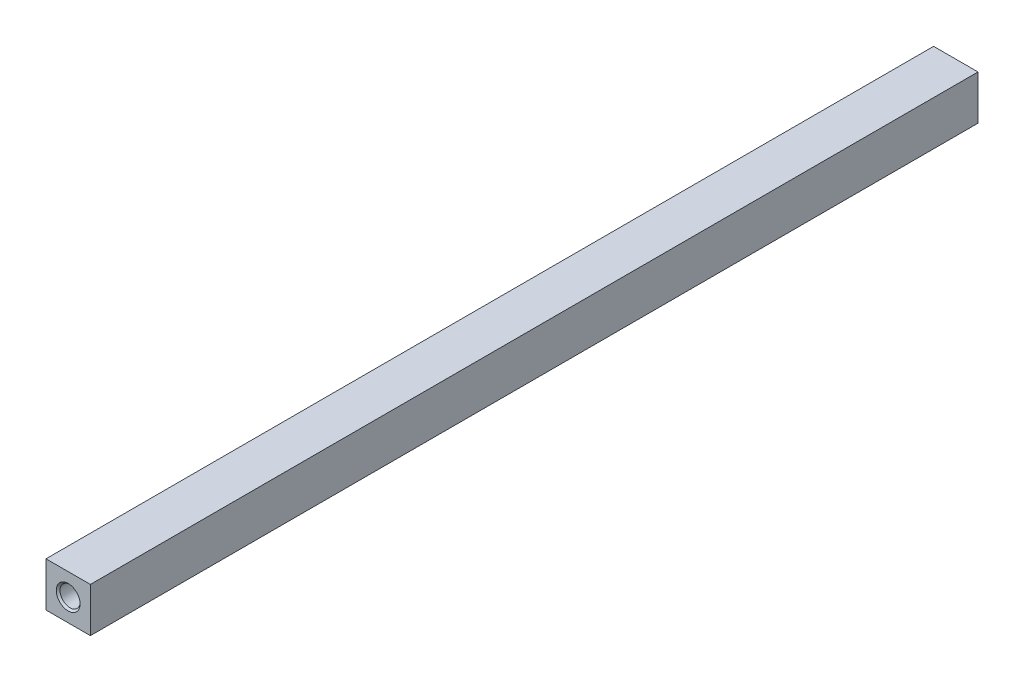
ISO-10303-21;
HEADER;
FILE_DESCRIPTION(('STEP AP214'),'2;1');
FILE_NAME('part.step','',(''),(''),'','','');
FILE_SCHEMA(('AUTOMOTIVE_DESIGN { 1 0 10303 214 1 1 1 1 }'));
ENDSEC;
DATA;
#1=APPLICATION_CONTEXT('core data for automotive mechanical design processes');
#2=APPLICATION_PROTOCOL_DEFINITION('international standard','automotive_design',2000,#1);
#3=PRODUCT_CONTEXT('',#1,'mechanical');
#4=PRODUCT('Part','Part','',(#3));
#5=PRODUCT_RELATED_PRODUCT_CATEGORY('part','',(#4));
#6=PRODUCT_DEFINITION_FORMATION('','',#4);
#7=PRODUCT_DEFINITION_CONTEXT('part definition',#1,'design');
#8=PRODUCT_DEFINITION('design','',#6,#7);
#9=PRODUCT_DEFINITION_SHAPE('','',#8);
#10=(LENGTH_UNIT() NAMED_UNIT(*) SI_UNIT(.MILLI.,.METRE.));
#11=(NAMED_UNIT(*) PLANE_ANGLE_UNIT() SI_UNIT($,.RADIAN.));
#12=(NAMED_UNIT(*) SI_UNIT($,.STERADIAN.) SOLID_ANGLE_UNIT());
#13=UNCERTAINTY_MEASURE_WITH_UNIT(LENGTH_MEASURE(1.E-05),#10,'distance_accuracy_value','');
#14=(GEOMETRIC_REPRESENTATION_CONTEXT(3) GLOBAL_UNCERTAINTY_ASSIGNED_CONTEXT((#13)) GLOBAL_UNIT_ASSIGNED_CONTEXT((#10,
#11,#12)) REPRESENTATION_CONTEXT('',''));
#15=CARTESIAN_POINT('',(0.,0.,0.));
#16=DIRECTION('',(0.,0.,1.));
#17=DIRECTION('',(1.,0.,0.));
#18=AXIS2_PLACEMENT_3D('',#15,#16,#17);
#19=CARTESIAN_POINT('',(7.5,-7.5,150.));
#20=DIRECTION('',(-1.,0.,0.));
#21=DIRECTION('',(0.,0.,1.));
#22=AXIS2_PLACEMENT_3D('',#19,#20,#21);
#23=PLANE('',#22);
#24=DIRECTION('',(0.,1.,0.));
#25=VECTOR('',#24,1.);
#26=CARTESIAN_POINT('',(7.5,-7.5,-150.));
#27=LINE('',#26,#25);
#28=CARTESIAN_POINT('',(7.5,-7.5,-150.));
#29=VERTEX_POINT('',#28);
#30=CARTESIAN_POINT('',(7.5,7.5,-150.));
#31=VERTEX_POINT('',#30);
#32=EDGE_CURVE('E124',#29,#31,#27,.T.);
#33=ORIENTED_EDGE('',*,*,#32,.T.);
#34=DIRECTION('',(0.,0.,-1.));
#35=VECTOR('',#34,1.);
#36=CARTESIAN_POINT('',(7.5,7.5,150.));
#37=LINE('',#36,#35);
#38=CARTESIAN_POINT('',(7.5,7.5,150.));
#39=VERTEX_POINT('',#38);
#40=EDGE_CURVE('E11',#39,#31,#37,.T.);
#41=ORIENTED_EDGE('',*,*,#40,.F.);
#42=DIRECTION('',(0.,1.,0.));
#43=VECTOR('',#42,1.);
#44=CARTESIAN_POINT('',(7.5,-7.5,150.));
#45=LINE('',#44,#43);
#46=CARTESIAN_POINT('',(7.5,-7.5,150.));
#47=VERTEX_POINT('',#46);
#48=EDGE_CURVE('E125',#47,#39,#45,.T.);
#49=ORIENTED_EDGE('',*,*,#48,.F.);
#50=DIRECTION('',(0.,0.,-1.));
#51=VECTOR('',#50,1.);
#52=CARTESIAN_POINT('',(7.5,-7.5,150.));
#53=LINE('',#52,#51);
#54=EDGE_CURVE('E131',#47,#29,#53,.T.);
#55=ORIENTED_EDGE('',*,*,#54,.T.);
#56=EDGE_LOOP('',(#33,#41,#49,#55));
#57=FACE_BOUND('',#56,.T.);
#58=ADVANCED_FACE('F44',(#57),#23,.F.);
#59=CARTESIAN_POINT('',(-7.5,7.5,150.));
#60=DIRECTION('',(0.,-1.,0.));
#61=DIRECTION('',(0.,0.,-1.));
#62=AXIS2_PLACEMENT_3D('',#59,#60,#61);
#63=PLANE('',#62);
#64=DIRECTION('',(-1.,0.,0.));
#65=VECTOR('',#64,1.);
#66=CARTESIAN_POINT('',(-7.5,7.5,-150.));
#67=LINE('',#66,#65);
#68=CARTESIAN_POINT('',(-7.5,7.5,-150.));
#69=VERTEX_POINT('',#68);
#70=EDGE_CURVE('E134',#31,#69,#67,.T.);
#71=ORIENTED_EDGE('',*,*,#70,.T.);
#72=DIRECTION('',(0.,0.,-1.));
#73=VECTOR('',#72,1.);
#74=CARTESIAN_POINT('',(-7.5,7.5,150.));
#75=LINE('',#74,#73);
#76=CARTESIAN_POINT('',(-7.5,7.5,150.));
#77=VERTEX_POINT('',#76);
#78=EDGE_CURVE('E52',#77,#69,#75,.T.);
#79=ORIENTED_EDGE('',*,*,#78,.F.);
#80=DIRECTION('',(-1.,0.,0.));
#81=VECTOR('',#80,1.);
#82=CARTESIAN_POINT('',(-7.5,7.5,150.));
#83=LINE('',#82,#81);
#84=EDGE_CURVE('E91',#39,#77,#83,.T.);
#85=ORIENTED_EDGE('',*,*,#84,.F.);
#86=ORIENTED_EDGE('',*,*,#40,.T.);
#87=EDGE_LOOP('',(#71,#79,#85,#86));
#88=FACE_BOUND('',#87,.T.);
#89=ADVANCED_FACE('F158',(#88),#63,.F.);
#90=CARTESIAN_POINT('',(-7.5,-7.5,150.));
#91=DIRECTION('',(1.,0.,0.));
#92=DIRECTION('',(0.,0.,-1.));
#93=AXIS2_PLACEMENT_3D('',#90,#91,#92);
#94=PLANE('',#93);
#95=DIRECTION('',(0.,-1.,0.));
#96=VECTOR('',#95,1.);
#97=CARTESIAN_POINT('',(-7.5,-7.5,-150.));
#98=LINE('',#97,#96);
#99=CARTESIAN_POINT('',(-7.5,-7.5,-150.));
#100=VERTEX_POINT('',#99);
#101=EDGE_CURVE('E78',#69,#100,#98,.T.);
#102=ORIENTED_EDGE('',*,*,#101,.T.);
#103=DIRECTION('',(0.,0.,-1.));
#104=VECTOR('',#103,1.);
#105=CARTESIAN_POINT('',(-7.5,-7.5,150.));
#106=LINE('',#105,#104);
#107=CARTESIAN_POINT('',(-7.5,-7.5,150.));
#108=VERTEX_POINT('',#107);
#109=EDGE_CURVE('E139',#108,#100,#106,.T.);
#110=ORIENTED_EDGE('',*,*,#109,.F.);
#111=DIRECTION('',(0.,-1.,0.));
#112=VECTOR('',#111,1.);
#113=CARTESIAN_POINT('',(-7.5,-7.5,150.));
#114=LINE('',#113,#112);
#115=EDGE_CURVE('E128',#77,#108,#114,.T.);
#116=ORIENTED_EDGE('',*,*,#115,.F.);
#117=ORIENTED_EDGE('',*,*,#78,.T.);
#118=EDGE_LOOP('',(#102,#110,#116,#117));
#119=FACE_BOUND('',#118,.T.);
#120=ADVANCED_FACE('F141',(#119),#94,.F.);
#121=CARTESIAN_POINT('',(-7.5,-7.5,150.));
#122=DIRECTION('',(0.,1.,0.));
#123=DIRECTION('',(0.,0.,1.));
#124=AXIS2_PLACEMENT_3D('',#121,#122,#123);
#125=PLANE('',#124);
#126=DIRECTION('',(1.,0.,0.));
#127=VECTOR('',#126,1.);
#128=CARTESIAN_POINT('',(-7.5,-7.5,-150.));
#129=LINE('',#128,#127);
#130=EDGE_CURVE('E84',#100,#29,#129,.T.);
#131=ORIENTED_EDGE('',*,*,#130,.T.);
#132=ORIENTED_EDGE('',*,*,#54,.F.);
#133=DIRECTION('',(1.,0.,0.));
#134=VECTOR('',#133,1.);
#135=CARTESIAN_POINT('',(-7.5,-7.5,150.));
#136=LINE('',#135,#134);
#137=EDGE_CURVE('E60',#108,#47,#136,.T.);
#138=ORIENTED_EDGE('',*,*,#137,.F.);
#139=ORIENTED_EDGE('',*,*,#109,.T.);
#140=EDGE_LOOP('',(#131,#132,#138,#139));
#141=FACE_BOUND('',#140,.T.);
#142=ADVANCED_FACE('F148',(#141),#125,.F.);
#143=CARTESIAN_POINT('',(0.,0.,150.));
#144=DIRECTION('',(0.,0.,-1.));
#145=DIRECTION('',(-1.,0.,0.));
#146=AXIS2_PLACEMENT_3D('',#143,#144,#145);
#147=PLANE('',#146);
#148=CARTESIAN_POINT('',(0.,0.,150.));
#149=DIRECTION('',(0.,0.,1.));
#150=DIRECTION('',(1.,0.,0.));
#151=AXIS2_PLACEMENT_3D('',#148,#149,#150);
#152=CIRCLE('',#151,4.025);
#153=CARTESIAN_POINT('',(4.025,0.,150.));
#154=VERTEX_POINT('',#153);
#155=EDGE_CURVE('E108',#154,#154,#152,.T.);
#156=ORIENTED_EDGE('',*,*,#155,.F.);
#157=EDGE_LOOP('',(#156));
#158=FACE_BOUND('',#157,.T.);
#159=ORIENTED_EDGE('',*,*,#48,.T.);
#160=ORIENTED_EDGE('',*,*,#84,.T.);
#161=ORIENTED_EDGE('',*,*,#115,.T.);
#162=ORIENTED_EDGE('',*,*,#137,.T.);
#163=EDGE_LOOP('',(#159,#160,#161,#162));
#164=FACE_BOUND('',#163,.T.);
#165=ADVANCED_FACE('F150',(#158,#164),#147,.F.);
#166=CARTESIAN_POINT('',(0.,0.,-150.));
#167=DIRECTION('',(0.,0.,-1.));
#168=DIRECTION('',(-1.,0.,0.));
#169=AXIS2_PLACEMENT_3D('',#166,#167,#168);
#170=PLANE('',#169);
#171=CARTESIAN_POINT('',(0.,0.,-150.));
#172=DIRECTION('',(0.,0.,-1.));
#173=DIRECTION('',(-1.,0.,0.));
#174=AXIS2_PLACEMENT_3D('',#171,#172,#173);
#175=CIRCLE('',#174,4.025);
#176=CARTESIAN_POINT('',(-4.025,0.,-150.));
#177=VERTEX_POINT('',#176);
#178=EDGE_CURVE('E115',#177,#177,#175,.T.);
#179=ORIENTED_EDGE('',*,*,#178,.F.);
#180=EDGE_LOOP('',(#179));
#181=FACE_BOUND('',#180,.T.);
#182=ORIENTED_EDGE('',*,*,#32,.F.);
#183=ORIENTED_EDGE('',*,*,#130,.F.);
#184=ORIENTED_EDGE('',*,*,#101,.F.);
#185=ORIENTED_EDGE('',*,*,#70,.F.);
#186=EDGE_LOOP('',(#182,#183,#184,#185));
#187=FACE_BOUND('',#186,.T.);
#188=ADVANCED_FACE('F144',(#181,#187),#170,.T.);
#189=CARTESIAN_POINT('',(0.,0.,127.75));
#190=DIRECTION('',(0.,0.,1.));
#191=DIRECTION('',(1.,0.,0.));
#192=AXIS2_PLACEMENT_3D('',#189,#190,#191);
#193=CONICAL_SURFACE('',#192,3.39999999999998,1.02974425867665);
#194=CARTESIAN_POINT('',(0.,0.,125.707073895306));
#195=VERTEX_POINT('',#194);
#196=VERTEX_LOOP('',#195);
#197=FACE_BOUND('',#196,.T.);
#198=CARTESIAN_POINT('',(0.,0.,127.75));
#199=DIRECTION('',(0.,0.,1.));
#200=DIRECTION('',(1.,0.,0.));
#201=AXIS2_PLACEMENT_3D('',#198,#199,#200);
#202=CIRCLE('',#201,3.39999999999998);
#203=CARTESIAN_POINT('',(3.39999999999998,0.,127.75));
#204=VERTEX_POINT('',#203);
#205=EDGE_CURVE('E121',#204,#204,#202,.T.);
#206=ORIENTED_EDGE('',*,*,#205,.T.);
#207=EDGE_LOOP('',(#206));
#208=FACE_BOUND('',#207,.T.);
#209=ADVANCED_FACE('F190',(#197,#208),#193,.F.);
#210=CARTESIAN_POINT('',(0.,0.,150.));
#211=DIRECTION('',(0.,0.,1.));
#212=DIRECTION('',(1.,0.,0.));
#213=AXIS2_PLACEMENT_3D('',#210,#211,#212);
#214=CYLINDRICAL_SURFACE('',#213,3.39999999999999);
#215=ORIENTED_EDGE('',*,*,#205,.F.);
#216=EDGE_LOOP('',(#215));
#217=FACE_BOUND('',#216,.T.);
#218=CARTESIAN_POINT('',(0.,0.,149.375));
#219=DIRECTION('',(0.,0.,1.));
#220=DIRECTION('',(1.,0.,0.));
#221=AXIS2_PLACEMENT_3D('',#218,#219,#220);
#222=CIRCLE('',#221,3.4);
#223=CARTESIAN_POINT('',(3.4,0.,149.375));
#224=VERTEX_POINT('',#223);
#225=EDGE_CURVE('E112',#224,#224,#222,.T.);
#226=ORIENTED_EDGE('',*,*,#225,.T.);
#227=EDGE_LOOP('',(#226));
#228=FACE_BOUND('',#227,.T.);
#229=ADVANCED_FACE('F195',(#217,#228),#214,.F.);
#230=CARTESIAN_POINT('',(0.,0.,150.));
#231=DIRECTION('',(0.,0.,1.));
#232=DIRECTION('',(1.,0.,0.));
#233=AXIS2_PLACEMENT_3D('',#230,#231,#232);
#234=CONICAL_SURFACE('',#233,4.025,0.78539816339744);
#235=ORIENTED_EDGE('',*,*,#225,.F.);
#236=EDGE_LOOP('',(#235));
#237=FACE_BOUND('',#236,.T.);
#238=ORIENTED_EDGE('',*,*,#155,.T.);
#239=EDGE_LOOP('',(#238));
#240=FACE_BOUND('',#239,.T.);
#241=ADVANCED_FACE('F102',(#237,#240),#234,.F.);
#242=CARTESIAN_POINT('',(0.,0.,-127.75));
#243=DIRECTION('',(0.,0.,-1.));
#244=DIRECTION('',(-1.,0.,0.));
#245=AXIS2_PLACEMENT_3D('',#242,#243,#244);
#246=CONICAL_SURFACE('',#245,3.39999999999998,1.02974425867665);
#247=CARTESIAN_POINT('',(0.,0.,-125.707073895306));
#248=VERTEX_POINT('',#247);
#249=VERTEX_LOOP('',#248);
#250=FACE_BOUND('',#249,.T.);
#251=CARTESIAN_POINT('',(0.,0.,-127.75));
#252=DIRECTION('',(0.,0.,-1.));
#253=DIRECTION('',(-1.,0.,0.));
#254=AXIS2_PLACEMENT_3D('',#251,#252,#253);
#255=CIRCLE('',#254,3.39999999999998);
#256=CARTESIAN_POINT('',(-3.39999999999998,0.,-127.75));
#257=VERTEX_POINT('',#256);
#258=EDGE_CURVE('E106',#257,#257,#255,.T.);
#259=ORIENTED_EDGE('',*,*,#258,.T.);
#260=EDGE_LOOP('',(#259));
#261=FACE_BOUND('',#260,.T.);
#262=ADVANCED_FACE('F98',(#250,#261),#246,.F.);
#263=CARTESIAN_POINT('',(0.,0.,-150.));
#264=DIRECTION('',(0.,0.,-1.));
#265=DIRECTION('',(-1.,0.,0.));
#266=AXIS2_PLACEMENT_3D('',#263,#264,#265);
#267=CYLINDRICAL_SURFACE('',#266,3.39999999999999);
#268=ORIENTED_EDGE('',*,*,#258,.F.);
#269=EDGE_LOOP('',(#268));
#270=FACE_BOUND('',#269,.T.);
#271=CARTESIAN_POINT('',(0.,0.,-149.375));
#272=DIRECTION('',(0.,0.,-1.));
#273=DIRECTION('',(-1.,0.,0.));
#274=AXIS2_PLACEMENT_3D('',#271,#272,#273);
#275=CIRCLE('',#274,3.4);
#276=CARTESIAN_POINT('',(-3.4,0.,-149.375));
#277=VERTEX_POINT('',#276);
#278=EDGE_CURVE('E109',#277,#277,#275,.T.);
#279=ORIENTED_EDGE('',*,*,#278,.T.);
#280=EDGE_LOOP('',(#279));
#281=FACE_BOUND('',#280,.T.);
#282=ADVANCED_FACE('F101',(#270,#281),#267,.F.);
#283=CARTESIAN_POINT('',(0.,0.,-150.));
#284=DIRECTION('',(0.,0.,-1.));
#285=DIRECTION('',(-1.,0.,0.));
#286=AXIS2_PLACEMENT_3D('',#283,#284,#285);
#287=CONICAL_SURFACE('',#286,4.025,0.78539816339744);
#288=ORIENTED_EDGE('',*,*,#278,.F.);
#289=EDGE_LOOP('',(#288));
#290=FACE_BOUND('',#289,.T.);
#291=ORIENTED_EDGE('',*,*,#178,.T.);
#292=EDGE_LOOP('',(#291));
#293=FACE_BOUND('',#292,.T.);
#294=ADVANCED_FACE('F242',(#290,#293),#287,.F.);
#295=CLOSED_SHELL('',(#58,#89,#120,#142,#165,#188,#209,#229,#241,#262,#282,#294));
#296=MANIFOLD_SOLID_BREP('B2',#295);
#297=ADVANCED_BREP_SHAPE_REPRESENTATION('',(#18,#296),#14);
#298=SHAPE_DEFINITION_REPRESENTATION(#9,#297);
ENDSEC;
END-ISO-10303-21;
